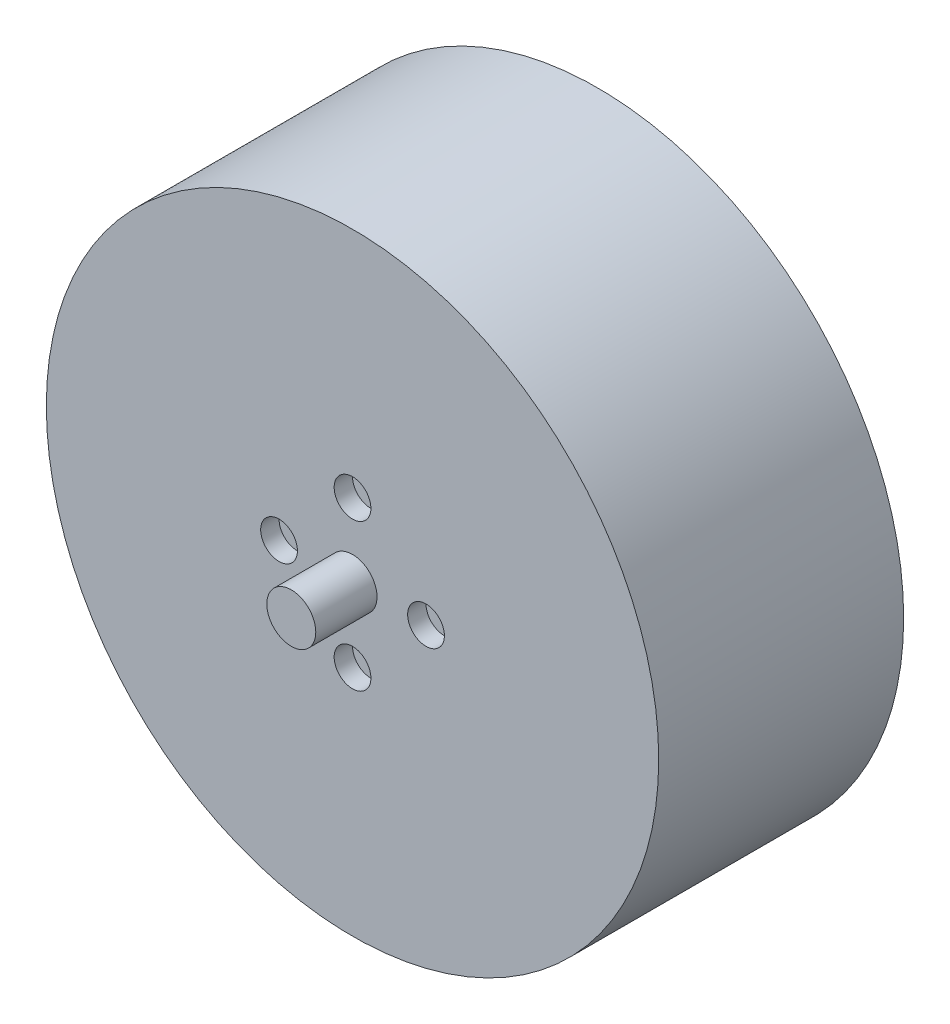
ISO-10303-21;
HEADER;
FILE_DESCRIPTION(('STEP AP214'),'2;1');
FILE_NAME('part.step','',(''),(''),'','','');
FILE_SCHEMA(('AUTOMOTIVE_DESIGN { 1 0 10303 214 1 1 1 1 }'));
ENDSEC;
DATA;
#1=APPLICATION_CONTEXT('core data for automotive mechanical design processes');
#2=APPLICATION_PROTOCOL_DEFINITION('international standard','automotive_design',2000,#1);
#3=PRODUCT_CONTEXT('',#1,'mechanical');
#4=PRODUCT('Part','Part','',(#3));
#5=PRODUCT_RELATED_PRODUCT_CATEGORY('part','',(#4));
#6=PRODUCT_DEFINITION_FORMATION('','',#4);
#7=PRODUCT_DEFINITION_CONTEXT('part definition',#1,'design');
#8=PRODUCT_DEFINITION('design','',#6,#7);
#9=PRODUCT_DEFINITION_SHAPE('','',#8);
#10=(LENGTH_UNIT() NAMED_UNIT(*) SI_UNIT(.MILLI.,.METRE.));
#11=(NAMED_UNIT(*) PLANE_ANGLE_UNIT() SI_UNIT($,.RADIAN.));
#12=(NAMED_UNIT(*) SI_UNIT($,.STERADIAN.) SOLID_ANGLE_UNIT());
#13=UNCERTAINTY_MEASURE_WITH_UNIT(LENGTH_MEASURE(1.E-05),#10,'distance_accuracy_value','');
#14=(GEOMETRIC_REPRESENTATION_CONTEXT(3) GLOBAL_UNCERTAINTY_ASSIGNED_CONTEXT((#13)) GLOBAL_UNIT_ASSIGNED_CONTEXT((#10,
#11,#12)) REPRESENTATION_CONTEXT('',''));
#15=CARTESIAN_POINT('',(0.,0.,0.));
#16=DIRECTION('',(0.,0.,1.));
#17=DIRECTION('',(1.,0.,0.));
#18=AXIS2_PLACEMENT_3D('',#15,#16,#17);
#19=CARTESIAN_POINT('',(0.,0.,4.));
#20=DIRECTION('',(0.,0.,1.));
#21=DIRECTION('',(1.,0.,0.));
#22=AXIS2_PLACEMENT_3D('',#19,#20,#21);
#23=PLANE('',#22);
#24=CARTESIAN_POINT('',(0.,0.,4.));
#25=DIRECTION('',(0.,0.,1.));
#26=DIRECTION('',(1.,0.,0.));
#27=AXIS2_PLACEMENT_3D('',#24,#25,#26);
#28=CIRCLE('',#27,5.);
#29=CARTESIAN_POINT('',(5.,0.,4.));
#30=VERTEX_POINT('',#29);
#31=EDGE_CURVE('E44',#30,#30,#28,.T.);
#32=ORIENTED_EDGE('',*,*,#31,.F.);
#33=EDGE_LOOP('',(#32));
#34=FACE_BOUND('',#33,.T.);
#35=CARTESIAN_POINT('',(0.,8.,4.));
#36=DIRECTION('',(0.,0.,1.));
#37=DIRECTION('',(1.,0.,0.));
#38=AXIS2_PLACEMENT_3D('',#35,#36,#37);
#39=CIRCLE('',#38,1.5);
#40=CARTESIAN_POINT('',(1.5,8.,4.));
#41=VERTEX_POINT('',#40);
#42=EDGE_CURVE('E88',#41,#41,#39,.T.);
#43=ORIENTED_EDGE('',*,*,#42,.F.);
#44=EDGE_LOOP('',(#43));
#45=FACE_BOUND('',#44,.T.);
#46=CARTESIAN_POINT('',(-9.5,0.,4.));
#47=DIRECTION('',(0.,0.,1.));
#48=DIRECTION('',(1.,0.,0.));
#49=AXIS2_PLACEMENT_3D('',#46,#47,#48);
#50=CIRCLE('',#49,1.5);
#51=CARTESIAN_POINT('',(-8.,0.,4.));
#52=VERTEX_POINT('',#51);
#53=EDGE_CURVE('E98',#52,#52,#50,.T.);
#54=ORIENTED_EDGE('',*,*,#53,.F.);
#55=EDGE_LOOP('',(#54));
#56=FACE_BOUND('',#55,.T.);
#57=CARTESIAN_POINT('',(0.,0.,4.));
#58=DIRECTION('',(0.,0.,1.));
#59=DIRECTION('',(1.,0.,0.));
#60=AXIS2_PLACEMENT_3D('',#57,#58,#59);
#61=CIRCLE('',#60,12.5);
#62=CARTESIAN_POINT('',(12.5,0.,4.));
#63=VERTEX_POINT('',#62);
#64=EDGE_CURVE('E49',#63,#63,#61,.T.);
#65=ORIENTED_EDGE('',*,*,#64,.T.);
#66=EDGE_LOOP('',(#65));
#67=FACE_BOUND('',#66,.T.);
#68=CARTESIAN_POINT('',(0.,-8.,4.));
#69=DIRECTION('',(0.,0.,1.));
#70=DIRECTION('',(1.,0.,0.));
#71=AXIS2_PLACEMENT_3D('',#68,#69,#70);
#72=CIRCLE('',#71,1.5);
#73=CARTESIAN_POINT('',(1.5,-8.,4.));
#74=VERTEX_POINT('',#73);
#75=EDGE_CURVE('E95',#74,#74,#72,.T.);
#76=ORIENTED_EDGE('',*,*,#75,.F.);
#77=EDGE_LOOP('',(#76));
#78=FACE_BOUND('',#77,.T.);
#79=CARTESIAN_POINT('',(9.5,0.,4.));
#80=DIRECTION('',(0.,0.,1.));
#81=DIRECTION('',(1.,0.,0.));
#82=AXIS2_PLACEMENT_3D('',#79,#80,#81);
#83=CIRCLE('',#82,1.5);
#84=CARTESIAN_POINT('',(11.,0.,4.));
#85=VERTEX_POINT('',#84);
#86=EDGE_CURVE('E79',#85,#85,#83,.T.);
#87=ORIENTED_EDGE('',*,*,#86,.F.);
#88=EDGE_LOOP('',(#87));
#89=FACE_BOUND('',#88,.T.);
#90=ADVANCED_FACE('F40',(#34,#45,#56,#67,#78,#89),#23,.T.);
#91=CARTESIAN_POINT('',(0.,0.,0.));
#92=DIRECTION('',(0.,0.,1.));
#93=DIRECTION('',(1.,0.,0.));
#94=AXIS2_PLACEMENT_3D('',#91,#92,#93);
#95=PLANE('',#94);
#96=CARTESIAN_POINT('',(0.,0.,0.));
#97=DIRECTION('',(0.,0.,1.));
#98=DIRECTION('',(1.,0.,0.));
#99=AXIS2_PLACEMENT_3D('',#96,#97,#98);
#100=CIRCLE('',#99,5.5);
#101=CARTESIAN_POINT('',(5.5,0.,0.));
#102=VERTEX_POINT('',#101);
#103=EDGE_CURVE('E41',#102,#102,#100,.T.);
#104=ORIENTED_EDGE('',*,*,#103,.T.);
#105=EDGE_LOOP('',(#104));
#106=FACE_BOUND('',#105,.T.);
#107=CARTESIAN_POINT('',(0.,0.,0.));
#108=DIRECTION('',(0.,0.,1.));
#109=DIRECTION('',(1.,0.,0.));
#110=AXIS2_PLACEMENT_3D('',#107,#108,#109);
#111=CIRCLE('',#110,12.5);
#112=CARTESIAN_POINT('',(12.5,0.,0.));
#113=VERTEX_POINT('',#112);
#114=EDGE_CURVE('E101',#113,#113,#111,.T.);
#115=ORIENTED_EDGE('',*,*,#114,.F.);
#116=EDGE_LOOP('',(#115));
#117=FACE_BOUND('',#116,.T.);
#118=CARTESIAN_POINT('',(-9.5,0.,0.));
#119=DIRECTION('',(0.,0.,1.));
#120=DIRECTION('',(1.,0.,0.));
#121=AXIS2_PLACEMENT_3D('',#118,#119,#120);
#122=CIRCLE('',#121,1.5);
#123=CARTESIAN_POINT('',(-8.,0.,0.));
#124=VERTEX_POINT('',#123);
#125=EDGE_CURVE('E92',#124,#124,#122,.T.);
#126=ORIENTED_EDGE('',*,*,#125,.T.);
#127=EDGE_LOOP('',(#126));
#128=FACE_BOUND('',#127,.T.);
#129=CARTESIAN_POINT('',(0.,-8.,0.));
#130=DIRECTION('',(0.,0.,1.));
#131=DIRECTION('',(1.,0.,0.));
#132=AXIS2_PLACEMENT_3D('',#129,#130,#131);
#133=CIRCLE('',#132,1.5);
#134=CARTESIAN_POINT('',(1.5,-8.,0.));
#135=VERTEX_POINT('',#134);
#136=EDGE_CURVE('E90',#135,#135,#133,.T.);
#137=ORIENTED_EDGE('',*,*,#136,.T.);
#138=EDGE_LOOP('',(#137));
#139=FACE_BOUND('',#138,.T.);
#140=CARTESIAN_POINT('',(0.,8.,0.));
#141=DIRECTION('',(0.,0.,1.));
#142=DIRECTION('',(1.,0.,0.));
#143=AXIS2_PLACEMENT_3D('',#140,#141,#142);
#144=CIRCLE('',#143,1.5);
#145=CARTESIAN_POINT('',(1.5,8.,0.));
#146=VERTEX_POINT('',#145);
#147=EDGE_CURVE('E84',#146,#146,#144,.T.);
#148=ORIENTED_EDGE('',*,*,#147,.T.);
#149=EDGE_LOOP('',(#148));
#150=FACE_BOUND('',#149,.T.);
#151=CARTESIAN_POINT('',(9.5,0.,0.));
#152=DIRECTION('',(0.,0.,1.));
#153=DIRECTION('',(1.,0.,0.));
#154=AXIS2_PLACEMENT_3D('',#151,#152,#153);
#155=CIRCLE('',#154,1.5);
#156=CARTESIAN_POINT('',(11.,0.,0.));
#157=VERTEX_POINT('',#156);
#158=EDGE_CURVE('E77',#157,#157,#155,.T.);
#159=ORIENTED_EDGE('',*,*,#158,.T.);
#160=EDGE_LOOP('',(#159));
#161=FACE_BOUND('',#160,.T.);
#162=ADVANCED_FACE('F153',(#106,#117,#128,#139,#150,#161),#95,.F.);
#163=CARTESIAN_POINT('',(0.,0.,4.));
#164=DIRECTION('',(0.,0.,-1.));
#165=DIRECTION('',(-1.,0.,0.));
#166=AXIS2_PLACEMENT_3D('',#163,#164,#165);
#167=CYLINDRICAL_SURFACE('',#166,12.5);
#168=ORIENTED_EDGE('',*,*,#64,.F.);
#169=EDGE_LOOP('',(#168));
#170=FACE_BOUND('',#169,.T.);
#171=ORIENTED_EDGE('',*,*,#114,.T.);
#172=EDGE_LOOP('',(#171));
#173=FACE_BOUND('',#172,.T.);
#174=ADVANCED_FACE('F39',(#170,#173),#167,.T.);
#175=CARTESIAN_POINT('',(-9.5,0.,4.));
#176=DIRECTION('',(0.,0.,-1.));
#177=DIRECTION('',(-1.,0.,0.));
#178=AXIS2_PLACEMENT_3D('',#175,#176,#177);
#179=CYLINDRICAL_SURFACE('',#178,1.5);
#180=ORIENTED_EDGE('',*,*,#53,.T.);
#181=EDGE_LOOP('',(#180));
#182=FACE_BOUND('',#181,.T.);
#183=ORIENTED_EDGE('',*,*,#125,.F.);
#184=EDGE_LOOP('',(#183));
#185=FACE_BOUND('',#184,.T.);
#186=ADVANCED_FACE('F164',(#182,#185),#179,.F.);
#187=CARTESIAN_POINT('',(0.,-8.,4.));
#188=DIRECTION('',(0.,0.,-1.));
#189=DIRECTION('',(-1.,0.,0.));
#190=AXIS2_PLACEMENT_3D('',#187,#188,#189);
#191=CYLINDRICAL_SURFACE('',#190,1.5);
#192=ORIENTED_EDGE('',*,*,#75,.T.);
#193=EDGE_LOOP('',(#192));
#194=FACE_BOUND('',#193,.T.);
#195=ORIENTED_EDGE('',*,*,#136,.F.);
#196=EDGE_LOOP('',(#195));
#197=FACE_BOUND('',#196,.T.);
#198=ADVANCED_FACE('F169',(#194,#197),#191,.F.);
#199=CARTESIAN_POINT('',(0.,8.,4.));
#200=DIRECTION('',(0.,0.,-1.));
#201=DIRECTION('',(-1.,0.,0.));
#202=AXIS2_PLACEMENT_3D('',#199,#200,#201);
#203=CYLINDRICAL_SURFACE('',#202,1.5);
#204=ORIENTED_EDGE('',*,*,#42,.T.);
#205=EDGE_LOOP('',(#204));
#206=FACE_BOUND('',#205,.T.);
#207=ORIENTED_EDGE('',*,*,#147,.F.);
#208=EDGE_LOOP('',(#207));
#209=FACE_BOUND('',#208,.T.);
#210=ADVANCED_FACE('F175',(#206,#209),#203,.F.);
#211=CARTESIAN_POINT('',(9.5,0.,4.));
#212=DIRECTION('',(0.,0.,-1.));
#213=DIRECTION('',(-1.,0.,0.));
#214=AXIS2_PLACEMENT_3D('',#211,#212,#213);
#215=CYLINDRICAL_SURFACE('',#214,1.5);
#216=ORIENTED_EDGE('',*,*,#86,.T.);
#217=EDGE_LOOP('',(#216));
#218=FACE_BOUND('',#217,.T.);
#219=ORIENTED_EDGE('',*,*,#158,.F.);
#220=EDGE_LOOP('',(#219));
#221=FACE_BOUND('',#220,.T.);
#222=ADVANCED_FACE('F177',(#218,#221),#215,.F.);
#223=CARTESIAN_POINT('',(0.,0.,7.));
#224=DIRECTION('',(0.,0.,-1.));
#225=DIRECTION('',(-1.,0.,0.));
#226=AXIS2_PLACEMENT_3D('',#223,#224,#225);
#227=CYLINDRICAL_SURFACE('',#226,5.);
#228=CARTESIAN_POINT('',(0.,0.,7.));
#229=DIRECTION('',(0.,0.,1.));
#230=DIRECTION('',(1.,0.,0.));
#231=AXIS2_PLACEMENT_3D('',#228,#229,#230);
#232=CIRCLE('',#231,5.);
#233=CARTESIAN_POINT('',(5.,0.,7.));
#234=VERTEX_POINT('',#233);
#235=EDGE_CURVE('E75',#234,#234,#232,.T.);
#236=ORIENTED_EDGE('',*,*,#235,.F.);
#237=EDGE_LOOP('',(#236));
#238=FACE_BOUND('',#237,.T.);
#239=ORIENTED_EDGE('',*,*,#31,.T.);
#240=EDGE_LOOP('',(#239));
#241=FACE_BOUND('',#240,.T.);
#242=ADVANCED_FACE('F139',(#238,#241),#227,.T.);
#243=CARTESIAN_POINT('',(0.,0.,27.));
#244=DIRECTION('',(0.,0.,-1.));
#245=DIRECTION('',(-1.,0.,0.));
#246=AXIS2_PLACEMENT_3D('',#243,#244,#245);
#247=CYLINDRICAL_SURFACE('',#246,25.);
#248=CARTESIAN_POINT('',(0.,0.,27.));
#249=DIRECTION('',(0.,0.,1.));
#250=DIRECTION('',(1.,0.,0.));
#251=AXIS2_PLACEMENT_3D('',#248,#249,#250);
#252=CIRCLE('',#251,25.);
#253=CARTESIAN_POINT('',(25.,0.,27.));
#254=VERTEX_POINT('',#253);
#255=EDGE_CURVE('E66',#254,#254,#252,.T.);
#256=ORIENTED_EDGE('',*,*,#255,.F.);
#257=EDGE_LOOP('',(#256));
#258=FACE_BOUND('',#257,.T.);
#259=CARTESIAN_POINT('',(0.,0.,7.));
#260=DIRECTION('',(0.,0.,1.));
#261=DIRECTION('',(1.,0.,0.));
#262=AXIS2_PLACEMENT_3D('',#259,#260,#261);
#263=CIRCLE('',#262,25.);
#264=CARTESIAN_POINT('',(25.,0.,7.));
#265=VERTEX_POINT('',#264);
#266=EDGE_CURVE('E71',#265,#265,#263,.T.);
#267=ORIENTED_EDGE('',*,*,#266,.T.);
#268=EDGE_LOOP('',(#267));
#269=FACE_BOUND('',#268,.T.);
#270=ADVANCED_FACE('F123',(#258,#269),#247,.T.);
#271=CARTESIAN_POINT('',(0.,0.,27.));
#272=DIRECTION('',(0.,0.,1.));
#273=DIRECTION('',(1.,0.,0.));
#274=AXIS2_PLACEMENT_3D('',#271,#272,#273);
#275=PLANE('',#274);
#276=CARTESIAN_POINT('',(0.,0.,27.));
#277=DIRECTION('',(0.,0.,1.));
#278=DIRECTION('',(1.,0.,0.));
#279=AXIS2_PLACEMENT_3D('',#276,#277,#278);
#280=CIRCLE('',#279,2.);
#281=CARTESIAN_POINT('',(2.,0.,27.));
#282=VERTEX_POINT('',#281);
#283=EDGE_CURVE('E10',#282,#282,#280,.T.);
#284=ORIENTED_EDGE('',*,*,#283,.F.);
#285=EDGE_LOOP('',(#284));
#286=FACE_BOUND('',#285,.T.);
#287=CARTESIAN_POINT('',(0.,6.,27.));
#288=DIRECTION('',(0.,0.,1.));
#289=DIRECTION('',(1.,0.,0.));
#290=AXIS2_PLACEMENT_3D('',#287,#288,#289);
#291=CIRCLE('',#290,1.5);
#292=CARTESIAN_POINT('',(1.5,6.,27.));
#293=VERTEX_POINT('',#292);
#294=EDGE_CURVE('E76',#293,#293,#291,.T.);
#295=ORIENTED_EDGE('',*,*,#294,.F.);
#296=EDGE_LOOP('',(#295));
#297=FACE_BOUND('',#296,.T.);
#298=CARTESIAN_POINT('',(6.,0.,27.));
#299=DIRECTION('',(0.,0.,1.));
#300=DIRECTION('',(1.,0.,0.));
#301=AXIS2_PLACEMENT_3D('',#298,#299,#300);
#302=CIRCLE('',#301,1.5);
#303=CARTESIAN_POINT('',(7.5,0.,27.));
#304=VERTEX_POINT('',#303);
#305=EDGE_CURVE('E114',#304,#304,#302,.T.);
#306=ORIENTED_EDGE('',*,*,#305,.F.);
#307=EDGE_LOOP('',(#306));
#308=FACE_BOUND('',#307,.T.);
#309=CARTESIAN_POINT('',(0.,-6.,27.));
#310=DIRECTION('',(0.,0.,1.));
#311=DIRECTION('',(1.,0.,0.));
#312=AXIS2_PLACEMENT_3D('',#309,#310,#311);
#313=CIRCLE('',#312,1.5);
#314=CARTESIAN_POINT('',(1.5,-6.,27.));
#315=VERTEX_POINT('',#314);
#316=EDGE_CURVE('E109',#315,#315,#313,.T.);
#317=ORIENTED_EDGE('',*,*,#316,.F.);
#318=EDGE_LOOP('',(#317));
#319=FACE_BOUND('',#318,.T.);
#320=CARTESIAN_POINT('',(-6.,0.,27.));
#321=DIRECTION('',(0.,0.,1.));
#322=DIRECTION('',(1.,0.,0.));
#323=AXIS2_PLACEMENT_3D('',#320,#321,#322);
#324=CIRCLE('',#323,1.5);
#325=CARTESIAN_POINT('',(-4.5,0.,27.));
#326=VERTEX_POINT('',#325);
#327=EDGE_CURVE('E56',#326,#326,#324,.T.);
#328=ORIENTED_EDGE('',*,*,#327,.F.);
#329=EDGE_LOOP('',(#328));
#330=FACE_BOUND('',#329,.T.);
#331=ORIENTED_EDGE('',*,*,#255,.T.);
#332=EDGE_LOOP('',(#331));
#333=FACE_BOUND('',#332,.T.);
#334=ADVANCED_FACE('F122',(#286,#297,#308,#319,#330,#333),#275,.T.);
#335=CARTESIAN_POINT('',(0.,0.,7.));
#336=DIRECTION('',(0.,0.,1.));
#337=DIRECTION('',(1.,0.,0.));
#338=AXIS2_PLACEMENT_3D('',#335,#336,#337);
#339=PLANE('',#338);
#340=ORIENTED_EDGE('',*,*,#235,.T.);
#341=EDGE_LOOP('',(#340));
#342=FACE_BOUND('',#341,.T.);
#343=ORIENTED_EDGE('',*,*,#266,.F.);
#344=EDGE_LOOP('',(#343));
#345=FACE_BOUND('',#344,.T.);
#346=ADVANCED_FACE('F121',(#342,#345),#339,.F.);
#347=CARTESIAN_POINT('',(-6.,0.,25.5));
#348=DIRECTION('',(0.,0.,1.));
#349=DIRECTION('',(1.,0.,0.));
#350=AXIS2_PLACEMENT_3D('',#347,#348,#349);
#351=CYLINDRICAL_SURFACE('',#350,1.5);
#352=ORIENTED_EDGE('',*,*,#327,.T.);
#353=EDGE_LOOP('',(#352));
#354=FACE_BOUND('',#353,.T.);
#355=CARTESIAN_POINT('',(-6.,0.,25.5));
#356=DIRECTION('',(0.,0.,1.));
#357=DIRECTION('',(1.,0.,0.));
#358=AXIS2_PLACEMENT_3D('',#355,#356,#357);
#359=CIRCLE('',#358,1.5);
#360=CARTESIAN_POINT('',(-4.5,0.,25.5));
#361=VERTEX_POINT('',#360);
#362=EDGE_CURVE('E67',#361,#361,#359,.T.);
#363=ORIENTED_EDGE('',*,*,#362,.F.);
#364=EDGE_LOOP('',(#363));
#365=FACE_BOUND('',#364,.T.);
#366=ADVANCED_FACE('F141',(#354,#365),#351,.F.);
#367=CARTESIAN_POINT('',(-6.,0.,25.5));
#368=DIRECTION('',(0.,0.,1.));
#369=DIRECTION('',(1.,0.,0.));
#370=AXIS2_PLACEMENT_3D('',#367,#368,#369);
#371=PLANE('',#370);
#372=ORIENTED_EDGE('',*,*,#362,.T.);
#373=EDGE_LOOP('',(#372));
#374=FACE_BOUND('',#373,.T.);
#375=ADVANCED_FACE('F149',(#374),#371,.T.);
#376=CARTESIAN_POINT('',(0.,-6.,25.5));
#377=DIRECTION('',(0.,0.,1.));
#378=DIRECTION('',(1.,0.,0.));
#379=AXIS2_PLACEMENT_3D('',#376,#377,#378);
#380=CYLINDRICAL_SURFACE('',#379,1.5);
#381=ORIENTED_EDGE('',*,*,#316,.T.);
#382=EDGE_LOOP('',(#381));
#383=FACE_BOUND('',#382,.T.);
#384=CARTESIAN_POINT('',(0.,-6.,25.5));
#385=DIRECTION('',(0.,0.,1.));
#386=DIRECTION('',(1.,0.,0.));
#387=AXIS2_PLACEMENT_3D('',#384,#385,#386);
#388=CIRCLE('',#387,1.5);
#389=CARTESIAN_POINT('',(1.5,-6.,25.5));
#390=VERTEX_POINT('',#389);
#391=EDGE_CURVE('E62',#390,#390,#388,.T.);
#392=ORIENTED_EDGE('',*,*,#391,.F.);
#393=EDGE_LOOP('',(#392));
#394=FACE_BOUND('',#393,.T.);
#395=ADVANCED_FACE('F218',(#383,#394),#380,.F.);
#396=CARTESIAN_POINT('',(0.,-6.,25.5));
#397=DIRECTION('',(0.,0.,1.));
#398=DIRECTION('',(1.,0.,0.));
#399=AXIS2_PLACEMENT_3D('',#396,#397,#398);
#400=PLANE('',#399);
#401=ORIENTED_EDGE('',*,*,#391,.T.);
#402=EDGE_LOOP('',(#401));
#403=FACE_BOUND('',#402,.T.);
#404=ADVANCED_FACE('F228',(#403),#400,.T.);
#405=CARTESIAN_POINT('',(6.,0.,25.5));
#406=DIRECTION('',(0.,0.,1.));
#407=DIRECTION('',(1.,0.,0.));
#408=AXIS2_PLACEMENT_3D('',#405,#406,#407);
#409=CYLINDRICAL_SURFACE('',#408,1.5);
#410=ORIENTED_EDGE('',*,*,#305,.T.);
#411=EDGE_LOOP('',(#410));
#412=FACE_BOUND('',#411,.T.);
#413=CARTESIAN_POINT('',(6.,0.,25.5));
#414=DIRECTION('',(0.,0.,1.));
#415=DIRECTION('',(1.,0.,0.));
#416=AXIS2_PLACEMENT_3D('',#413,#414,#415);
#417=CIRCLE('',#416,1.5);
#418=CARTESIAN_POINT('',(7.5,0.,25.5));
#419=VERTEX_POINT('',#418);
#420=EDGE_CURVE('E58',#419,#419,#417,.T.);
#421=ORIENTED_EDGE('',*,*,#420,.F.);
#422=EDGE_LOOP('',(#421));
#423=FACE_BOUND('',#422,.T.);
#424=ADVANCED_FACE('F239',(#412,#423),#409,.F.);
#425=CARTESIAN_POINT('',(6.,0.,25.5));
#426=DIRECTION('',(0.,0.,1.));
#427=DIRECTION('',(1.,0.,0.));
#428=AXIS2_PLACEMENT_3D('',#425,#426,#427);
#429=PLANE('',#428);
#430=ORIENTED_EDGE('',*,*,#420,.T.);
#431=EDGE_LOOP('',(#430));
#432=FACE_BOUND('',#431,.T.);
#433=ADVANCED_FACE('F246',(#432),#429,.T.);
#434=CARTESIAN_POINT('',(0.,6.,25.5));
#435=DIRECTION('',(0.,0.,1.));
#436=DIRECTION('',(1.,0.,0.));
#437=AXIS2_PLACEMENT_3D('',#434,#435,#436);
#438=CYLINDRICAL_SURFACE('',#437,1.5);
#439=ORIENTED_EDGE('',*,*,#294,.T.);
#440=EDGE_LOOP('',(#439));
#441=FACE_BOUND('',#440,.T.);
#442=CARTESIAN_POINT('',(0.,6.,25.5));
#443=DIRECTION('',(0.,0.,1.));
#444=DIRECTION('',(1.,0.,0.));
#445=AXIS2_PLACEMENT_3D('',#442,#443,#444);
#446=CIRCLE('',#445,1.5);
#447=CARTESIAN_POINT('',(1.5,6.,25.5));
#448=VERTEX_POINT('',#447);
#449=EDGE_CURVE('E57',#448,#448,#446,.T.);
#450=ORIENTED_EDGE('',*,*,#449,.F.);
#451=EDGE_LOOP('',(#450));
#452=FACE_BOUND('',#451,.T.);
#453=ADVANCED_FACE('F117',(#441,#452),#438,.F.);
#454=CARTESIAN_POINT('',(0.,6.,25.5));
#455=DIRECTION('',(0.,0.,1.));
#456=DIRECTION('',(1.,0.,0.));
#457=AXIS2_PLACEMENT_3D('',#454,#455,#456);
#458=PLANE('',#457);
#459=ORIENTED_EDGE('',*,*,#449,.T.);
#460=EDGE_LOOP('',(#459));
#461=FACE_BOUND('',#460,.T.);
#462=ADVANCED_FACE('F268',(#461),#458,.T.);
#463=CARTESIAN_POINT('',(0.,0.,32.));
#464=DIRECTION('',(0.,0.,-1.));
#465=DIRECTION('',(-1.,0.,0.));
#466=AXIS2_PLACEMENT_3D('',#463,#464,#465);
#467=CYLINDRICAL_SURFACE('',#466,2.);
#468=CARTESIAN_POINT('',(0.,0.,32.));
#469=DIRECTION('',(0.,0.,1.));
#470=DIRECTION('',(1.,0.,0.));
#471=AXIS2_PLACEMENT_3D('',#468,#469,#470);
#472=CIRCLE('',#471,2.);
#473=CARTESIAN_POINT('',(2.,0.,32.));
#474=VERTEX_POINT('',#473);
#475=EDGE_CURVE('E53',#474,#474,#472,.T.);
#476=ORIENTED_EDGE('',*,*,#475,.F.);
#477=EDGE_LOOP('',(#476));
#478=FACE_BOUND('',#477,.T.);
#479=ORIENTED_EDGE('',*,*,#283,.T.);
#480=EDGE_LOOP('',(#479));
#481=FACE_BOUND('',#480,.T.);
#482=ADVANCED_FACE('F277',(#478,#481),#467,.T.);
#483=CARTESIAN_POINT('',(0.,0.,32.));
#484=DIRECTION('',(0.,0.,1.));
#485=DIRECTION('',(1.,0.,0.));
#486=AXIS2_PLACEMENT_3D('',#483,#484,#485);
#487=PLANE('',#486);
#488=ORIENTED_EDGE('',*,*,#475,.T.);
#489=EDGE_LOOP('',(#488));
#490=FACE_BOUND('',#489,.T.);
#491=ADVANCED_FACE('F284',(#490),#487,.T.);
#492=CARTESIAN_POINT('',(0.,0.,1.5));
#493=DIRECTION('',(0.,0.,-1.));
#494=DIRECTION('',(-1.,0.,0.));
#495=AXIS2_PLACEMENT_3D('',#492,#493,#494);
#496=CYLINDRICAL_SURFACE('',#495,5.5);
#497=CARTESIAN_POINT('',(0.,0.,1.5));
#498=DIRECTION('',(0.,0.,-1.));
#499=DIRECTION('',(-1.,0.,0.));
#500=AXIS2_PLACEMENT_3D('',#497,#498,#499);
#501=CIRCLE('',#500,5.5);
#502=CARTESIAN_POINT('',(-5.5,0.,1.5));
#503=VERTEX_POINT('',#502);
#504=EDGE_CURVE('E342',#503,#503,#501,.T.);
#505=ORIENTED_EDGE('',*,*,#504,.F.);
#506=EDGE_LOOP('',(#505));
#507=FACE_BOUND('',#506,.T.);
#508=ORIENTED_EDGE('',*,*,#103,.F.);
#509=EDGE_LOOP('',(#508));
#510=FACE_BOUND('',#509,.T.);
#511=ADVANCED_FACE('F293',(#507,#510),#496,.F.);
#512=CARTESIAN_POINT('',(0.,0.,1.5));
#513=DIRECTION('',(0.,0.,-1.));
#514=DIRECTION('',(-1.,0.,0.));
#515=AXIS2_PLACEMENT_3D('',#512,#513,#514);
#516=PLANE('',#515);
#517=CARTESIAN_POINT('',(0.,0.,1.5));
#518=DIRECTION('',(0.,0.,-1.));
#519=DIRECTION('',(-1.,0.,0.));
#520=AXIS2_PLACEMENT_3D('',#517,#518,#519);
#521=CIRCLE('',#520,1.5);
#522=CARTESIAN_POINT('',(-1.5,0.,1.5));
#523=VERTEX_POINT('',#522);
#524=EDGE_CURVE('E345',#523,#523,#521,.T.);
#525=ORIENTED_EDGE('',*,*,#524,.F.);
#526=EDGE_LOOP('',(#525));
#527=FACE_BOUND('',#526,.T.);
#528=ORIENTED_EDGE('',*,*,#504,.T.);
#529=EDGE_LOOP('',(#528));
#530=FACE_BOUND('',#529,.T.);
#531=ADVANCED_FACE('F303',(#527,#530),#516,.T.);
#532=CARTESIAN_POINT('',(0.,0.,6.5));
#533=DIRECTION('',(0.,0.,-1.));
#534=DIRECTION('',(-1.,0.,0.));
#535=AXIS2_PLACEMENT_3D('',#532,#533,#534);
#536=CYLINDRICAL_SURFACE('',#535,1.5);
#537=CARTESIAN_POINT('',(0.,0.,6.5));
#538=DIRECTION('',(0.,0.,-1.));
#539=DIRECTION('',(-1.,0.,0.));
#540=AXIS2_PLACEMENT_3D('',#537,#538,#539);
#541=CIRCLE('',#540,1.5);
#542=CARTESIAN_POINT('',(-1.5,0.,6.5));
#543=VERTEX_POINT('',#542);
#544=EDGE_CURVE('E339',#543,#543,#541,.T.);
#545=ORIENTED_EDGE('',*,*,#544,.F.);
#546=EDGE_LOOP('',(#545));
#547=FACE_BOUND('',#546,.T.);
#548=ORIENTED_EDGE('',*,*,#524,.T.);
#549=EDGE_LOOP('',(#548));
#550=FACE_BOUND('',#549,.T.);
#551=ADVANCED_FACE('F312',(#547,#550),#536,.F.);
#552=CARTESIAN_POINT('',(0.,0.,6.5));
#553=DIRECTION('',(0.,0.,-1.));
#554=DIRECTION('',(-1.,0.,0.));
#555=AXIS2_PLACEMENT_3D('',#552,#553,#554);
#556=PLANE('',#555);
#557=ORIENTED_EDGE('',*,*,#544,.T.);
#558=EDGE_LOOP('',(#557));
#559=FACE_BOUND('',#558,.T.);
#560=ADVANCED_FACE('F324',(#559),#556,.T.);
#561=CLOSED_SHELL('',(#90,#162,#174,#186,#198,#210,#222,#242,#270,#334,#346,#366,#375,#395,#404,
#424,#433,#453,#462,#482,#491,#511,#531,#551,#560));
#562=MANIFOLD_SOLID_BREP('B2',#561);
#563=ADVANCED_BREP_SHAPE_REPRESENTATION('',(#18,#562),#14);
#564=SHAPE_DEFINITION_REPRESENTATION(#9,#563);
ENDSEC;
END-ISO-10303-21;
